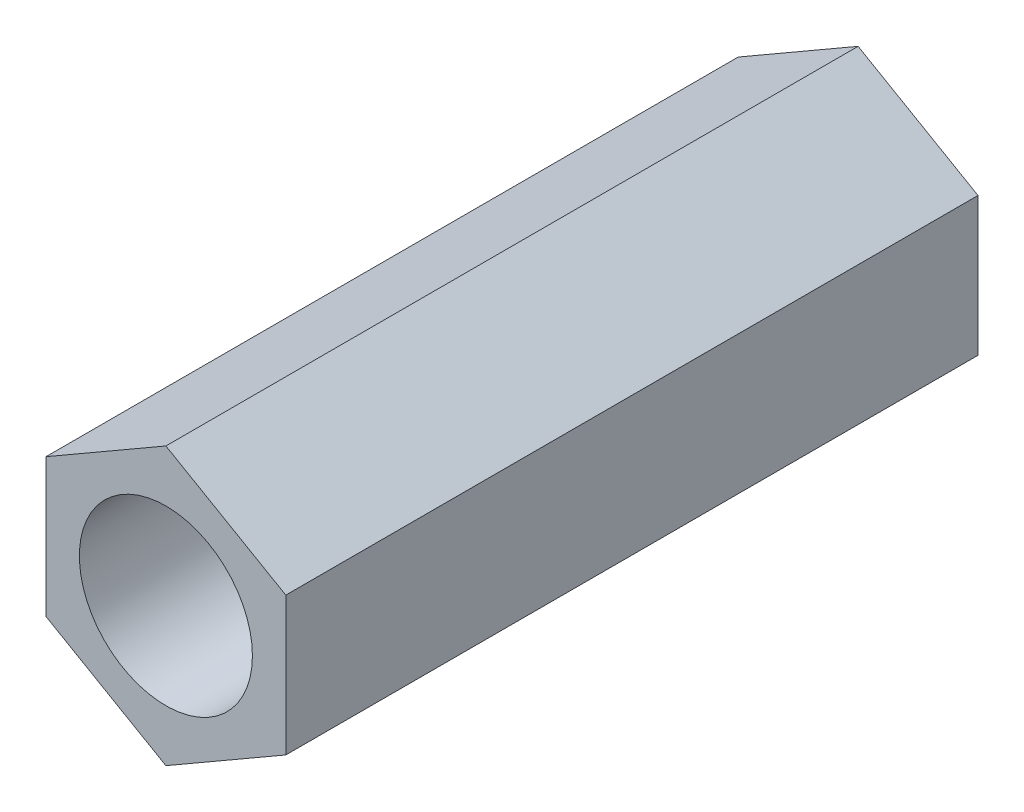
ISO-10303-21;
HEADER;
FILE_DESCRIPTION(('STEP AP214'),'2;1');
FILE_NAME('part.step','',(''),(''),'','','');
FILE_SCHEMA(('AUTOMOTIVE_DESIGN { 1 0 10303 214 1 1 1 1 }'));
ENDSEC;
DATA;
#1=APPLICATION_CONTEXT('core data for automotive mechanical design processes');
#2=APPLICATION_PROTOCOL_DEFINITION('international standard','automotive_design',2000,#1);
#3=PRODUCT_CONTEXT('',#1,'mechanical');
#4=PRODUCT('Part','Part','',(#3));
#5=PRODUCT_RELATED_PRODUCT_CATEGORY('part','',(#4));
#6=PRODUCT_DEFINITION_FORMATION('','',#4);
#7=PRODUCT_DEFINITION_CONTEXT('part definition',#1,'design');
#8=PRODUCT_DEFINITION('design','',#6,#7);
#9=PRODUCT_DEFINITION_SHAPE('','',#8);
#10=(LENGTH_UNIT() NAMED_UNIT(*) SI_UNIT(.MILLI.,.METRE.));
#11=(NAMED_UNIT(*) PLANE_ANGLE_UNIT() SI_UNIT($,.RADIAN.));
#12=(NAMED_UNIT(*) SI_UNIT($,.STERADIAN.) SOLID_ANGLE_UNIT());
#13=UNCERTAINTY_MEASURE_WITH_UNIT(LENGTH_MEASURE(1.E-05),#10,'distance_accuracy_value','');
#14=(GEOMETRIC_REPRESENTATION_CONTEXT(3) GLOBAL_UNCERTAINTY_ASSIGNED_CONTEXT((#13)) GLOBAL_UNIT_ASSIGNED_CONTEXT((#10,
#11,#12)) REPRESENTATION_CONTEXT('',''));
#15=CARTESIAN_POINT('',(0.,0.,0.));
#16=DIRECTION('',(0.,0.,1.));
#17=DIRECTION('',(1.,0.,0.));
#18=AXIS2_PLACEMENT_3D('',#15,#16,#17);
#19=CARTESIAN_POINT('',(0.,0.,2.));
#20=DIRECTION('',(0.,0.,1.));
#21=DIRECTION('',(1.,0.,0.));
#22=AXIS2_PLACEMENT_3D('',#19,#20,#21);
#23=PLANE('',#22);
#24=DIRECTION('',(-0.866025403784439,0.5,0.));
#25=VECTOR('',#24,1.);
#26=CARTESIAN_POINT('',(0.346410161513775,0.2,2.));
#27=LINE('',#26,#25);
#28=CARTESIAN_POINT('',(0.346410161513775,0.2,2.));
#29=VERTEX_POINT('',#28);
#30=CARTESIAN_POINT('',(0.,0.4,2.));
#31=VERTEX_POINT('',#30);
#32=EDGE_CURVE('E131',#29,#31,#27,.T.);
#33=ORIENTED_EDGE('',*,*,#32,.T.);
#34=DIRECTION('',(-0.866025403784438,-0.5,0.));
#35=VECTOR('',#34,1.);
#36=CARTESIAN_POINT('',(0.,0.4,2.));
#37=LINE('',#36,#35);
#38=CARTESIAN_POINT('',(-0.346410161513775,0.2,2.));
#39=VERTEX_POINT('',#38);
#40=EDGE_CURVE('E89',#31,#39,#37,.T.);
#41=ORIENTED_EDGE('',*,*,#40,.T.);
#42=DIRECTION('',(0.,-1.,0.));
#43=VECTOR('',#42,1.);
#44=CARTESIAN_POINT('',(-0.346410161513775,0.2,2.));
#45=LINE('',#44,#43);
#46=CARTESIAN_POINT('',(-0.346410161513775,-0.2,2.));
#47=VERTEX_POINT('',#46);
#48=EDGE_CURVE('E102',#39,#47,#45,.T.);
#49=ORIENTED_EDGE('',*,*,#48,.T.);
#50=DIRECTION('',(0.866025403784438,-0.5,0.));
#51=VECTOR('',#50,1.);
#52=CARTESIAN_POINT('',(-0.346410161513775,-0.2,2.));
#53=LINE('',#52,#51);
#54=CARTESIAN_POINT('',(0.,-0.4,2.));
#55=VERTEX_POINT('',#54);
#56=EDGE_CURVE('E96',#47,#55,#53,.T.);
#57=ORIENTED_EDGE('',*,*,#56,.T.);
#58=DIRECTION('',(0.866025403784439,0.5,0.));
#59=VECTOR('',#58,1.);
#60=CARTESIAN_POINT('',(0.,-0.4,2.));
#61=LINE('',#60,#59);
#62=CARTESIAN_POINT('',(0.346410161513775,-0.2,2.));
#63=VERTEX_POINT('',#62);
#64=EDGE_CURVE('E100',#55,#63,#61,.T.);
#65=ORIENTED_EDGE('',*,*,#64,.T.);
#66=DIRECTION('',(0.,1.,0.));
#67=VECTOR('',#66,1.);
#68=CARTESIAN_POINT('',(0.346410161513775,-0.2,2.));
#69=LINE('',#68,#67);
#70=EDGE_CURVE('E52',#63,#29,#69,.T.);
#71=ORIENTED_EDGE('',*,*,#70,.T.);
#72=EDGE_LOOP('',(#33,#41,#49,#57,#65,#71));
#73=FACE_BOUND('',#72,.T.);
#74=CARTESIAN_POINT('',(0.,0.,2.));
#75=DIRECTION('',(0.,0.,1.));
#76=DIRECTION('',(1.,0.,0.));
#77=AXIS2_PLACEMENT_3D('',#74,#75,#76);
#78=CIRCLE('',#77,0.25);
#79=CARTESIAN_POINT('',(0.25,0.,2.));
#80=VERTEX_POINT('',#79);
#81=EDGE_CURVE('E124',#80,#80,#78,.T.);
#82=ORIENTED_EDGE('',*,*,#81,.F.);
#83=EDGE_LOOP('',(#82));
#84=FACE_BOUND('',#83,.T.);
#85=ADVANCED_FACE('F35',(#73,#84),#23,.T.);
#86=CARTESIAN_POINT('',(0.,0.,0.));
#87=DIRECTION('',(0.,0.,1.));
#88=DIRECTION('',(1.,0.,0.));
#89=AXIS2_PLACEMENT_3D('',#86,#87,#88);
#90=PLANE('',#89);
#91=DIRECTION('',(-0.866025403784439,0.5,0.));
#92=VECTOR('',#91,1.);
#93=CARTESIAN_POINT('',(0.346410161513775,0.2,0.));
#94=LINE('',#93,#92);
#95=CARTESIAN_POINT('',(0.346410161513775,0.2,0.));
#96=VERTEX_POINT('',#95);
#97=CARTESIAN_POINT('',(0.,0.4,0.));
#98=VERTEX_POINT('',#97);
#99=EDGE_CURVE('E120',#96,#98,#94,.T.);
#100=ORIENTED_EDGE('',*,*,#99,.F.);
#101=DIRECTION('',(0.,1.,0.));
#102=VECTOR('',#101,1.);
#103=CARTESIAN_POINT('',(0.346410161513775,-0.2,0.));
#104=LINE('',#103,#102);
#105=CARTESIAN_POINT('',(0.346410161513775,-0.2,0.));
#106=VERTEX_POINT('',#105);
#107=EDGE_CURVE('E81',#106,#96,#104,.T.);
#108=ORIENTED_EDGE('',*,*,#107,.F.);
#109=DIRECTION('',(0.866025403784439,0.5,0.));
#110=VECTOR('',#109,1.);
#111=CARTESIAN_POINT('',(0.,-0.4,0.));
#112=LINE('',#111,#110);
#113=CARTESIAN_POINT('',(0.,-0.4,0.));
#114=VERTEX_POINT('',#113);
#115=EDGE_CURVE('E75',#114,#106,#112,.T.);
#116=ORIENTED_EDGE('',*,*,#115,.F.);
#117=DIRECTION('',(0.866025403784438,-0.5,0.));
#118=VECTOR('',#117,1.);
#119=CARTESIAN_POINT('',(-0.346410161513775,-0.2,0.));
#120=LINE('',#119,#118);
#121=CARTESIAN_POINT('',(-0.346410161513775,-0.2,0.));
#122=VERTEX_POINT('',#121);
#123=EDGE_CURVE('E110',#122,#114,#120,.T.);
#124=ORIENTED_EDGE('',*,*,#123,.F.);
#125=DIRECTION('',(0.,-1.,0.));
#126=VECTOR('',#125,1.);
#127=CARTESIAN_POINT('',(-0.346410161513775,0.2,0.));
#128=LINE('',#127,#126);
#129=CARTESIAN_POINT('',(-0.346410161513775,0.2,0.));
#130=VERTEX_POINT('',#129);
#131=EDGE_CURVE('E126',#130,#122,#128,.T.);
#132=ORIENTED_EDGE('',*,*,#131,.F.);
#133=DIRECTION('',(-0.866025403784438,-0.5,0.));
#134=VECTOR('',#133,1.);
#135=CARTESIAN_POINT('',(0.,0.4,0.));
#136=LINE('',#135,#134);
#137=EDGE_CURVE('E123',#98,#130,#136,.T.);
#138=ORIENTED_EDGE('',*,*,#137,.F.);
#139=EDGE_LOOP('',(#100,#108,#116,#124,#132,#138));
#140=FACE_BOUND('',#139,.T.);
#141=CARTESIAN_POINT('',(0.,0.,0.));
#142=DIRECTION('',(0.,0.,1.));
#143=DIRECTION('',(1.,0.,0.));
#144=AXIS2_PLACEMENT_3D('',#141,#142,#143);
#145=CIRCLE('',#144,0.25);
#146=CARTESIAN_POINT('',(0.25,0.,0.));
#147=VERTEX_POINT('',#146);
#148=EDGE_CURVE('E224',#147,#147,#145,.T.);
#149=ORIENTED_EDGE('',*,*,#148,.T.);
#150=EDGE_LOOP('',(#149));
#151=FACE_BOUND('',#150,.T.);
#152=ADVANCED_FACE('F140',(#140,#151),#90,.F.);
#153=CARTESIAN_POINT('',(0.346410161513775,0.2,2.));
#154=DIRECTION('',(-0.5,-0.866025403784439,0.));
#155=DIRECTION('',(0.866025403784439,-0.5,0.));
#156=AXIS2_PLACEMENT_3D('',#153,#154,#155);
#157=PLANE('',#156);
#158=ORIENTED_EDGE('',*,*,#99,.T.);
#159=DIRECTION('',(0.,0.,-1.));
#160=VECTOR('',#159,1.);
#161=CARTESIAN_POINT('',(0.,0.4,2.));
#162=LINE('',#161,#160);
#163=EDGE_CURVE('E11',#31,#98,#162,.T.);
#164=ORIENTED_EDGE('',*,*,#163,.F.);
#165=ORIENTED_EDGE('',*,*,#32,.F.);
#166=DIRECTION('',(0.,0.,-1.));
#167=VECTOR('',#166,1.);
#168=CARTESIAN_POINT('',(0.346410161513775,0.2,2.));
#169=LINE('',#168,#167);
#170=EDGE_CURVE('E116',#29,#96,#169,.T.);
#171=ORIENTED_EDGE('',*,*,#170,.T.);
#172=EDGE_LOOP('',(#158,#164,#165,#171));
#173=FACE_BOUND('',#172,.T.);
#174=ADVANCED_FACE('F37',(#173),#157,.F.);
#175=CARTESIAN_POINT('',(0.,0.4,2.));
#176=DIRECTION('',(0.5,-0.866025403784439,0.));
#177=DIRECTION('',(0.866025403784439,0.5,0.));
#178=AXIS2_PLACEMENT_3D('',#175,#176,#177);
#179=PLANE('',#178);
#180=ORIENTED_EDGE('',*,*,#137,.T.);
#181=DIRECTION('',(0.,0.,-1.));
#182=VECTOR('',#181,1.);
#183=CARTESIAN_POINT('',(-0.346410161513775,0.2,2.));
#184=LINE('',#183,#182);
#185=EDGE_CURVE('E44',#39,#130,#184,.T.);
#186=ORIENTED_EDGE('',*,*,#185,.F.);
#187=ORIENTED_EDGE('',*,*,#40,.F.);
#188=ORIENTED_EDGE('',*,*,#163,.T.);
#189=EDGE_LOOP('',(#180,#186,#187,#188));
#190=FACE_BOUND('',#189,.T.);
#191=ADVANCED_FACE('F165',(#190),#179,.F.);
#192=CARTESIAN_POINT('',(-0.346410161513775,0.2,2.));
#193=DIRECTION('',(1.,0.,0.));
#194=DIRECTION('',(0.,1.,0.));
#195=AXIS2_PLACEMENT_3D('',#192,#193,#194);
#196=PLANE('',#195);
#197=ORIENTED_EDGE('',*,*,#131,.T.);
#198=DIRECTION('',(0.,0.,-1.));
#199=VECTOR('',#198,1.);
#200=CARTESIAN_POINT('',(-0.346410161513775,-0.2,2.));
#201=LINE('',#200,#199);
#202=EDGE_CURVE('E111',#47,#122,#201,.T.);
#203=ORIENTED_EDGE('',*,*,#202,.F.);
#204=ORIENTED_EDGE('',*,*,#48,.F.);
#205=ORIENTED_EDGE('',*,*,#185,.T.);
#206=EDGE_LOOP('',(#197,#203,#204,#205));
#207=FACE_BOUND('',#206,.T.);
#208=ADVANCED_FACE('F137',(#207),#196,.F.);
#209=CARTESIAN_POINT('',(-0.346410161513775,-0.2,2.));
#210=DIRECTION('',(0.5,0.866025403784439,0.));
#211=DIRECTION('',(-0.866025403784439,0.5,0.));
#212=AXIS2_PLACEMENT_3D('',#209,#210,#211);
#213=PLANE('',#212);
#214=ORIENTED_EDGE('',*,*,#123,.T.);
#215=DIRECTION('',(0.,0.,-1.));
#216=VECTOR('',#215,1.);
#217=CARTESIAN_POINT('',(0.,-0.4,2.));
#218=LINE('',#217,#216);
#219=EDGE_CURVE('E107',#55,#114,#218,.T.);
#220=ORIENTED_EDGE('',*,*,#219,.F.);
#221=ORIENTED_EDGE('',*,*,#56,.F.);
#222=ORIENTED_EDGE('',*,*,#202,.T.);
#223=EDGE_LOOP('',(#214,#220,#221,#222));
#224=FACE_BOUND('',#223,.T.);
#225=ADVANCED_FACE('F108',(#224),#213,.F.);
#226=CARTESIAN_POINT('',(0.,-0.4,2.));
#227=DIRECTION('',(-0.5,0.866025403784439,0.));
#228=DIRECTION('',(-0.866025403784439,-0.5,0.));
#229=AXIS2_PLACEMENT_3D('',#226,#227,#228);
#230=PLANE('',#229);
#231=ORIENTED_EDGE('',*,*,#115,.T.);
#232=DIRECTION('',(0.,0.,-1.));
#233=VECTOR('',#232,1.);
#234=CARTESIAN_POINT('',(0.346410161513775,-0.2,2.));
#235=LINE('',#234,#233);
#236=EDGE_CURVE('E112',#63,#106,#235,.T.);
#237=ORIENTED_EDGE('',*,*,#236,.F.);
#238=ORIENTED_EDGE('',*,*,#64,.F.);
#239=ORIENTED_EDGE('',*,*,#219,.T.);
#240=EDGE_LOOP('',(#231,#237,#238,#239));
#241=FACE_BOUND('',#240,.T.);
#242=ADVANCED_FACE('F114',(#241),#230,.F.);
#243=CARTESIAN_POINT('',(0.346410161513775,-0.2,2.));
#244=DIRECTION('',(-1.,0.,0.));
#245=DIRECTION('',(0.,-1.,0.));
#246=AXIS2_PLACEMENT_3D('',#243,#244,#245);
#247=PLANE('',#246);
#248=ORIENTED_EDGE('',*,*,#107,.T.);
#249=ORIENTED_EDGE('',*,*,#170,.F.);
#250=ORIENTED_EDGE('',*,*,#70,.F.);
#251=ORIENTED_EDGE('',*,*,#236,.T.);
#252=EDGE_LOOP('',(#248,#249,#250,#251));
#253=FACE_BOUND('',#252,.T.);
#254=ADVANCED_FACE('F145',(#253),#247,.F.);
#255=CARTESIAN_POINT('',(0.,0.,2.));
#256=DIRECTION('',(0.,0.,-1.));
#257=DIRECTION('',(-1.,0.,0.));
#258=AXIS2_PLACEMENT_3D('',#255,#256,#257);
#259=CYLINDRICAL_SURFACE('',#258,0.25);
#260=ORIENTED_EDGE('',*,*,#81,.T.);
#261=EDGE_LOOP('',(#260));
#262=FACE_BOUND('',#261,.T.);
#263=ORIENTED_EDGE('',*,*,#148,.F.);
#264=EDGE_LOOP('',(#263));
#265=FACE_BOUND('',#264,.T.);
#266=ADVANCED_FACE('F147',(#262,#265),#259,.F.);
#267=CLOSED_SHELL('',(#85,#152,#174,#191,#208,#225,#242,#254,#266));
#268=MANIFOLD_SOLID_BREP('B2',#267);
#269=ADVANCED_BREP_SHAPE_REPRESENTATION('',(#18,#268),#14);
#270=SHAPE_DEFINITION_REPRESENTATION(#9,#269);
ENDSEC;
END-ISO-10303-21;
